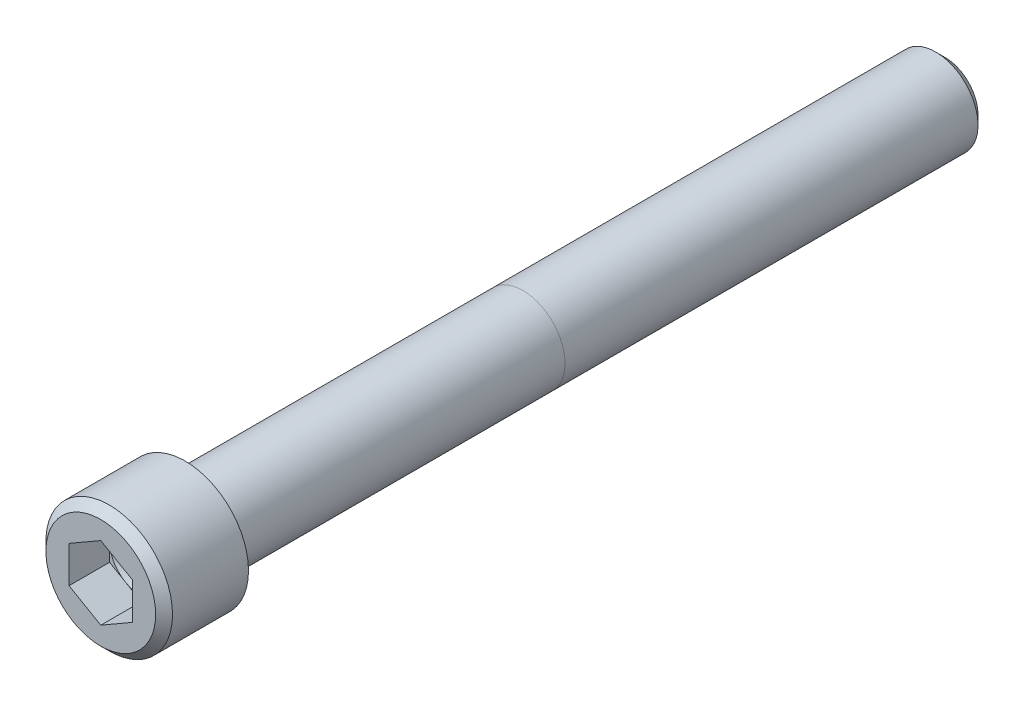
ISO-10303-21;
HEADER;
FILE_DESCRIPTION(('STEP AP214'),'2;1');
FILE_NAME('part.step','',(''),(''),'','','');
FILE_SCHEMA(('AUTOMOTIVE_DESIGN { 1 0 10303 214 1 1 1 1 }'));
ENDSEC;
DATA;
#1=APPLICATION_CONTEXT('core data for automotive mechanical design processes');
#2=APPLICATION_PROTOCOL_DEFINITION('international standard','automotive_design',2000,#1);
#3=PRODUCT_CONTEXT('',#1,'mechanical');
#4=PRODUCT('Part','Part','',(#3));
#5=PRODUCT_RELATED_PRODUCT_CATEGORY('part','',(#4));
#6=PRODUCT_DEFINITION_FORMATION('','',#4);
#7=PRODUCT_DEFINITION_CONTEXT('part definition',#1,'design');
#8=PRODUCT_DEFINITION('design','',#6,#7);
#9=PRODUCT_DEFINITION_SHAPE('','',#8);
#10=(LENGTH_UNIT() NAMED_UNIT(*) SI_UNIT(.MILLI.,.METRE.));
#11=(NAMED_UNIT(*) PLANE_ANGLE_UNIT() SI_UNIT($,.RADIAN.));
#12=(NAMED_UNIT(*) SI_UNIT($,.STERADIAN.) SOLID_ANGLE_UNIT());
#13=UNCERTAINTY_MEASURE_WITH_UNIT(LENGTH_MEASURE(1.E-05),#10,'distance_accuracy_value','');
#14=(GEOMETRIC_REPRESENTATION_CONTEXT(3) GLOBAL_UNCERTAINTY_ASSIGNED_CONTEXT((#13)) GLOBAL_UNIT_ASSIGNED_CONTEXT((#10,
#11,#12)) REPRESENTATION_CONTEXT('',''));
#15=CARTESIAN_POINT('',(0.,0.,0.));
#16=DIRECTION('',(0.,0.,1.));
#17=DIRECTION('',(1.,0.,0.));
#18=AXIS2_PLACEMENT_3D('',#15,#16,#17);
#19=CARTESIAN_POINT('',(0.,0.,-57.15));
#20=DIRECTION('',(0.,0.,1.));
#21=DIRECTION('',(1.,0.,0.));
#22=AXIS2_PLACEMENT_3D('',#19,#20,#21);
#23=CYLINDRICAL_SURFACE('',#22,3.175);
#24=CARTESIAN_POINT('',(0.,0.,-0.1778));
#25=DIRECTION('',(0.,0.,1.));
#26=DIRECTION('',(1.,0.,0.));
#27=AXIS2_PLACEMENT_3D('',#24,#25,#26);
#28=CIRCLE('',#27,3.175);
#29=CARTESIAN_POINT('',(3.175,0.,-0.1778));
#30=VERTEX_POINT('',#29);
#31=EDGE_CURVE('E137',#30,#30,#28,.F.);
#32=ORIENTED_EDGE('',*,*,#31,.T.);
#33=EDGE_LOOP('',(#32));
#34=FACE_BOUND('',#33,.T.);
#35=CARTESIAN_POINT('',(0.,0.,-25.4));
#36=DIRECTION('',(0.,0.,-1.));
#37=DIRECTION('',(-1.,0.,0.));
#38=AXIS2_PLACEMENT_3D('',#35,#36,#37);
#39=CIRCLE('',#38,3.175);
#40=CARTESIAN_POINT('',(-3.175,0.,-25.4));
#41=VERTEX_POINT('',#40);
#42=EDGE_CURVE('E11',#41,#41,#39,.T.);
#43=ORIENTED_EDGE('',*,*,#42,.F.);
#44=EDGE_LOOP('',(#43));
#45=FACE_BOUND('',#44,.T.);
#46=ADVANCED_FACE('F17',(#34,#45),#23,.T.);
#47=CARTESIAN_POINT('',(0.,0.,3.302));
#48=DIRECTION('',(0.,0.,1.));
#49=DIRECTION('',(1.,0.,0.));
#50=AXIS2_PLACEMENT_3D('',#47,#48,#49);
#51=PLANE('',#50);
#52=DIRECTION('',(0.,1.,0.));
#53=VECTOR('',#52,1.);
#54=CARTESIAN_POINT('',(-2.3876,0.,3.302));
#55=LINE('',#54,#53);
#56=CARTESIAN_POINT('',(-2.3876,0.,3.302));
#57=VERTEX_POINT('',#56);
#58=CARTESIAN_POINT('',(-2.3876,1.37848150271715,3.302));
#59=VERTEX_POINT('',#58);
#60=EDGE_CURVE('E194',#57,#59,#55,.T.);
#61=ORIENTED_EDGE('',*,*,#60,.F.);
#62=CARTESIAN_POINT('',(0.,0.,3.302));
#63=DIRECTION('',(0.,0.,-1.));
#64=DIRECTION('',(-1.,0.,0.));
#65=AXIS2_PLACEMENT_3D('',#62,#63,#64);
#66=CIRCLE('',#65,2.3876);
#67=CARTESIAN_POINT('',(-1.1938,2.06772225407573,3.302));
#68=VERTEX_POINT('',#67);
#69=EDGE_CURVE('E32',#57,#68,#66,.T.);
#70=ORIENTED_EDGE('',*,*,#69,.T.);
#71=DIRECTION('',(0.866025403784438,0.5,0.));
#72=VECTOR('',#71,1.);
#73=CARTESIAN_POINT('',(-1.1938,2.06772225407573,3.302));
#74=LINE('',#73,#72);
#75=EDGE_CURVE('E195',#59,#68,#74,.T.);
#76=ORIENTED_EDGE('',*,*,#75,.F.);
#77=EDGE_LOOP('',(#61,#70,#76));
#78=FACE_BOUND('',#77,.T.);
#79=ADVANCED_FACE('F105',(#78),#51,.T.);
#80=CARTESIAN_POINT('',(0.,2.7569630054343,3.302));
#81=VERTEX_POINT('',#80);
#82=EDGE_CURVE('E198',#68,#81,#74,.T.);
#83=ORIENTED_EDGE('',*,*,#82,.F.);
#84=CARTESIAN_POINT('',(1.1938,2.06772225407573,3.302));
#85=VERTEX_POINT('',#84);
#86=EDGE_CURVE('E139',#68,#85,#66,.T.);
#87=ORIENTED_EDGE('',*,*,#86,.T.);
#88=DIRECTION('',(0.866025403784439,-0.5,0.));
#89=VECTOR('',#88,1.);
#90=CARTESIAN_POINT('',(1.1938,2.06772225407573,3.302));
#91=LINE('',#90,#89);
#92=EDGE_CURVE('E199',#81,#85,#91,.T.);
#93=ORIENTED_EDGE('',*,*,#92,.F.);
#94=EDGE_LOOP('',(#83,#87,#93));
#95=FACE_BOUND('',#94,.T.);
#96=ADVANCED_FACE('F111',(#95),#51,.T.);
#97=CARTESIAN_POINT('',(2.3876,1.37848150271715,3.302));
#98=VERTEX_POINT('',#97);
#99=EDGE_CURVE('E166',#85,#98,#91,.T.);
#100=ORIENTED_EDGE('',*,*,#99,.F.);
#101=CARTESIAN_POINT('',(2.3876,0.,3.302));
#102=VERTEX_POINT('',#101);
#103=EDGE_CURVE('E206',#85,#102,#66,.T.);
#104=ORIENTED_EDGE('',*,*,#103,.T.);
#105=DIRECTION('',(0.,-1.,0.));
#106=VECTOR('',#105,1.);
#107=CARTESIAN_POINT('',(2.3876,0.,3.302));
#108=LINE('',#107,#106);
#109=EDGE_CURVE('E162',#98,#102,#108,.T.);
#110=ORIENTED_EDGE('',*,*,#109,.F.);
#111=EDGE_LOOP('',(#100,#104,#110));
#112=FACE_BOUND('',#111,.T.);
#113=ADVANCED_FACE('F223',(#112),#51,.T.);
#114=CARTESIAN_POINT('',(2.3876,-1.37848150271715,3.302));
#115=VERTEX_POINT('',#114);
#116=EDGE_CURVE('E182',#102,#115,#108,.T.);
#117=ORIENTED_EDGE('',*,*,#116,.F.);
#118=CARTESIAN_POINT('',(1.1938,-2.06772225407573,3.302));
#119=VERTEX_POINT('',#118);
#120=EDGE_CURVE('E211',#102,#119,#66,.T.);
#121=ORIENTED_EDGE('',*,*,#120,.T.);
#122=DIRECTION('',(-0.866025403784439,-0.5,0.));
#123=VECTOR('',#122,1.);
#124=CARTESIAN_POINT('',(1.1938,-2.06772225407573,3.302));
#125=LINE('',#124,#123);
#126=EDGE_CURVE('E183',#115,#119,#125,.T.);
#127=ORIENTED_EDGE('',*,*,#126,.F.);
#128=EDGE_LOOP('',(#117,#121,#127));
#129=FACE_BOUND('',#128,.T.);
#130=ADVANCED_FACE('F224',(#129),#51,.T.);
#131=CARTESIAN_POINT('',(0.,-2.7569630054343,3.302));
#132=VERTEX_POINT('',#131);
#133=EDGE_CURVE('E186',#119,#132,#125,.T.);
#134=ORIENTED_EDGE('',*,*,#133,.F.);
#135=CARTESIAN_POINT('',(-1.1938,-2.06772225407573,3.302));
#136=VERTEX_POINT('',#135);
#137=EDGE_CURVE('E207',#119,#136,#66,.T.);
#138=ORIENTED_EDGE('',*,*,#137,.T.);
#139=DIRECTION('',(-0.866025403784439,0.5,0.));
#140=VECTOR('',#139,1.);
#141=CARTESIAN_POINT('',(-1.1938,-2.06772225407573,3.302));
#142=LINE('',#141,#140);
#143=EDGE_CURVE('E187',#132,#136,#142,.T.);
#144=ORIENTED_EDGE('',*,*,#143,.F.);
#145=EDGE_LOOP('',(#134,#138,#144));
#146=FACE_BOUND('',#145,.T.);
#147=ADVANCED_FACE('F124',(#146),#51,.T.);
#148=CARTESIAN_POINT('',(0.,0.,6.35));
#149=DIRECTION('',(0.,0.,1.));
#150=DIRECTION('',(1.,0.,0.));
#151=AXIS2_PLACEMENT_3D('',#148,#149,#150);
#152=PLANE('',#151);
#153=CARTESIAN_POINT('',(0.,0.,6.35));
#154=DIRECTION('',(0.,0.,1.));
#155=DIRECTION('',(1.,0.,0.));
#156=AXIS2_PLACEMENT_3D('',#153,#154,#155);
#157=CIRCLE('',#156,4.1275);
#158=CARTESIAN_POINT('',(4.1275,0.,6.35));
#159=VERTEX_POINT('',#158);
#160=EDGE_CURVE('E144',#159,#159,#157,.T.);
#161=ORIENTED_EDGE('',*,*,#160,.T.);
#162=EDGE_LOOP('',(#161));
#163=FACE_BOUND('',#162,.T.);
#164=DIRECTION('',(0.866025403784438,0.5,0.));
#165=VECTOR('',#164,1.);
#166=CARTESIAN_POINT('',(-1.1938,2.06772225407573,6.35));
#167=LINE('',#166,#165);
#168=CARTESIAN_POINT('',(-2.3876,1.37848150271715,6.35));
#169=VERTEX_POINT('',#168);
#170=CARTESIAN_POINT('',(0.,2.7569630054343,6.35));
#171=VERTEX_POINT('',#170);
#172=EDGE_CURVE('E174',#169,#171,#167,.T.);
#173=ORIENTED_EDGE('',*,*,#172,.T.);
#174=DIRECTION('',(0.866025403784439,-0.5,0.));
#175=VECTOR('',#174,1.);
#176=CARTESIAN_POINT('',(1.1938,2.06772225407573,6.35));
#177=LINE('',#176,#175);
#178=CARTESIAN_POINT('',(2.3876,1.37848150271715,6.35));
#179=VERTEX_POINT('',#178);
#180=EDGE_CURVE('E177',#171,#179,#177,.T.);
#181=ORIENTED_EDGE('',*,*,#180,.T.);
#182=DIRECTION('',(0.,-1.,0.));
#183=VECTOR('',#182,1.);
#184=CARTESIAN_POINT('',(2.3876,0.,6.35));
#185=LINE('',#184,#183);
#186=CARTESIAN_POINT('',(2.3876,-1.37848150271715,6.35));
#187=VERTEX_POINT('',#186);
#188=EDGE_CURVE('E163',#179,#187,#185,.T.);
#189=ORIENTED_EDGE('',*,*,#188,.T.);
#190=DIRECTION('',(-0.866025403784439,-0.5,0.));
#191=VECTOR('',#190,1.);
#192=CARTESIAN_POINT('',(1.1938,-2.06772225407573,6.35));
#193=LINE('',#192,#191);
#194=CARTESIAN_POINT('',(0.,-2.7569630054343,6.35));
#195=VERTEX_POINT('',#194);
#196=EDGE_CURVE('E40',#187,#195,#193,.T.);
#197=ORIENTED_EDGE('',*,*,#196,.T.);
#198=DIRECTION('',(-0.866025403784439,0.5,0.));
#199=VECTOR('',#198,1.);
#200=CARTESIAN_POINT('',(-1.1938,-2.06772225407573,6.35));
#201=LINE('',#200,#199);
#202=CARTESIAN_POINT('',(-2.3876,-1.37848150271715,6.35));
#203=VERTEX_POINT('',#202);
#204=EDGE_CURVE('E168',#195,#203,#201,.T.);
#205=ORIENTED_EDGE('',*,*,#204,.T.);
#206=DIRECTION('',(0.,1.,0.));
#207=VECTOR('',#206,1.);
#208=CARTESIAN_POINT('',(-2.3876,0.,6.35));
#209=LINE('',#208,#207);
#210=EDGE_CURVE('E171',#203,#169,#209,.T.);
#211=ORIENTED_EDGE('',*,*,#210,.T.);
#212=EDGE_LOOP('',(#173,#181,#189,#197,#205,#211));
#213=FACE_BOUND('',#212,.T.);
#214=ADVANCED_FACE('F248',(#163,#213),#152,.T.);
#215=CARTESIAN_POINT('',(0.,0.,6.35));
#216=DIRECTION('',(0.,0.,-1.));
#217=DIRECTION('',(-1.,0.,0.));
#218=AXIS2_PLACEMENT_3D('',#215,#216,#217);
#219=CYLINDRICAL_SURFACE('',#218,4.7625);
#220=CARTESIAN_POINT('',(0.,0.,5.715));
#221=DIRECTION('',(0.,0.,1.));
#222=DIRECTION('',(1.,0.,0.));
#223=AXIS2_PLACEMENT_3D('',#220,#221,#222);
#224=CIRCLE('',#223,4.7625);
#225=CARTESIAN_POINT('',(4.7625,0.,5.715));
#226=VERTEX_POINT('',#225);
#227=EDGE_CURVE('E140',#226,#226,#224,.F.);
#228=ORIENTED_EDGE('',*,*,#227,.T.);
#229=EDGE_LOOP('',(#228));
#230=FACE_BOUND('',#229,.T.);
#231=CARTESIAN_POINT('',(0.,0.,0.));
#232=DIRECTION('',(0.,0.,1.));
#233=DIRECTION('',(1.,0.,0.));
#234=AXIS2_PLACEMENT_3D('',#231,#232,#233);
#235=CIRCLE('',#234,4.7625);
#236=CARTESIAN_POINT('',(4.7625,0.,0.));
#237=VERTEX_POINT('',#236);
#238=EDGE_CURVE('E147',#237,#237,#235,.T.);
#239=ORIENTED_EDGE('',*,*,#238,.T.);
#240=EDGE_LOOP('',(#239));
#241=FACE_BOUND('',#240,.T.);
#242=ADVANCED_FACE('F250',(#230,#241),#219,.T.);
#243=CARTESIAN_POINT('',(0.,0.,0.));
#244=DIRECTION('',(0.,0.,1.));
#245=DIRECTION('',(1.,0.,0.));
#246=AXIS2_PLACEMENT_3D('',#243,#244,#245);
#247=PLANE('',#246);
#248=CARTESIAN_POINT('',(0.,0.,0.));
#249=DIRECTION('',(0.,0.,1.));
#250=DIRECTION('',(1.,0.,0.));
#251=AXIS2_PLACEMENT_3D('',#248,#249,#250);
#252=CIRCLE('',#251,3.3528);
#253=CARTESIAN_POINT('',(3.3528,0.,0.));
#254=VERTEX_POINT('',#253);
#255=EDGE_CURVE('E132',#254,#254,#252,.T.);
#256=ORIENTED_EDGE('',*,*,#255,.T.);
#257=EDGE_LOOP('',(#256));
#258=FACE_BOUND('',#257,.T.);
#259=ORIENTED_EDGE('',*,*,#238,.F.);
#260=EDGE_LOOP('',(#259));
#261=FACE_BOUND('',#260,.T.);
#262=ADVANCED_FACE('F257',(#258,#261),#247,.F.);
#263=CARTESIAN_POINT('',(0.,0.,6.35));
#264=DIRECTION('',(0.,0.,-1.));
#265=DIRECTION('',(-1.,0.,0.));
#266=AXIS2_PLACEMENT_3D('',#263,#264,#265);
#267=CONICAL_SURFACE('',#266,4.1275,0.785398163397448);
#268=ORIENTED_EDGE('',*,*,#227,.F.);
#269=EDGE_LOOP('',(#268));
#270=FACE_BOUND('',#269,.T.);
#271=ORIENTED_EDGE('',*,*,#160,.F.);
#272=EDGE_LOOP('',(#271));
#273=FACE_BOUND('',#272,.T.);
#274=ADVANCED_FACE('F264',(#270,#273),#267,.T.);
#275=CARTESIAN_POINT('',(1.1938,2.06772225407573,3.302));
#276=DIRECTION('',(-0.5,-0.866025403784439,0.));
#277=DIRECTION('',(0.866025403784439,-0.5,0.));
#278=AXIS2_PLACEMENT_3D('',#275,#276,#277);
#279=PLANE('',#278);
#280=ORIENTED_EDGE('',*,*,#180,.F.);
#281=DIRECTION('',(0.,0.,1.));
#282=VECTOR('',#281,1.);
#283=CARTESIAN_POINT('',(0.,2.7569630054343,3.302));
#284=LINE('',#283,#282);
#285=EDGE_CURVE('E150',#81,#171,#284,.T.);
#286=ORIENTED_EDGE('',*,*,#285,.F.);
#287=ORIENTED_EDGE('',*,*,#92,.T.);
#288=ORIENTED_EDGE('',*,*,#99,.T.);
#289=DIRECTION('',(0.,0.,1.));
#290=VECTOR('',#289,1.);
#291=CARTESIAN_POINT('',(2.3876,1.37848150271715,3.302));
#292=LINE('',#291,#290);
#293=EDGE_CURVE('E160',#98,#179,#292,.T.);
#294=ORIENTED_EDGE('',*,*,#293,.T.);
#295=EDGE_LOOP('',(#280,#286,#287,#288,#294));
#296=FACE_BOUND('',#295,.T.);
#297=ADVANCED_FACE('F230',(#296),#279,.T.);
#298=CARTESIAN_POINT('',(-1.1938,2.06772225407573,3.302));
#299=DIRECTION('',(0.5,-0.866025403784438,0.));
#300=DIRECTION('',(0.866025403784438,0.5,0.));
#301=AXIS2_PLACEMENT_3D('',#298,#299,#300);
#302=PLANE('',#301);
#303=ORIENTED_EDGE('',*,*,#172,.F.);
#304=DIRECTION('',(0.,0.,1.));
#305=VECTOR('',#304,1.);
#306=CARTESIAN_POINT('',(-2.3876,1.37848150271715,3.302));
#307=LINE('',#306,#305);
#308=EDGE_CURVE('E152',#59,#169,#307,.T.);
#309=ORIENTED_EDGE('',*,*,#308,.F.);
#310=ORIENTED_EDGE('',*,*,#75,.T.);
#311=ORIENTED_EDGE('',*,*,#82,.T.);
#312=ORIENTED_EDGE('',*,*,#285,.T.);
#313=EDGE_LOOP('',(#303,#309,#310,#311,#312));
#314=FACE_BOUND('',#313,.T.);
#315=ADVANCED_FACE('F237',(#314),#302,.T.);
#316=CARTESIAN_POINT('',(-2.3876,0.,3.302));
#317=DIRECTION('',(1.,0.,0.));
#318=DIRECTION('',(0.,1.,0.));
#319=AXIS2_PLACEMENT_3D('',#316,#317,#318);
#320=PLANE('',#319);
#321=ORIENTED_EDGE('',*,*,#210,.F.);
#322=DIRECTION('',(0.,0.,1.));
#323=VECTOR('',#322,1.);
#324=CARTESIAN_POINT('',(-2.3876,-1.37848150271715,3.302));
#325=LINE('',#324,#323);
#326=CARTESIAN_POINT('',(-2.3876,-1.37848150271715,3.302));
#327=VERTEX_POINT('',#326);
#328=EDGE_CURVE('E154',#327,#203,#325,.T.);
#329=ORIENTED_EDGE('',*,*,#328,.F.);
#330=EDGE_CURVE('E191',#327,#57,#55,.T.);
#331=ORIENTED_EDGE('',*,*,#330,.T.);
#332=ORIENTED_EDGE('',*,*,#60,.T.);
#333=ORIENTED_EDGE('',*,*,#308,.T.);
#334=EDGE_LOOP('',(#321,#329,#331,#332,#333));
#335=FACE_BOUND('',#334,.T.);
#336=ADVANCED_FACE('F241',(#335),#320,.T.);
#337=CARTESIAN_POINT('',(-1.1938,-2.06772225407573,3.302));
#338=DIRECTION('',(0.5,0.866025403784439,0.));
#339=DIRECTION('',(-0.866025403784439,0.5,0.));
#340=AXIS2_PLACEMENT_3D('',#337,#338,#339);
#341=PLANE('',#340);
#342=ORIENTED_EDGE('',*,*,#204,.F.);
#343=DIRECTION('',(0.,0.,1.));
#344=VECTOR('',#343,1.);
#345=CARTESIAN_POINT('',(0.,-2.7569630054343,3.302));
#346=LINE('',#345,#344);
#347=EDGE_CURVE('E156',#132,#195,#346,.T.);
#348=ORIENTED_EDGE('',*,*,#347,.F.);
#349=ORIENTED_EDGE('',*,*,#143,.T.);
#350=EDGE_CURVE('E190',#136,#327,#142,.T.);
#351=ORIENTED_EDGE('',*,*,#350,.T.);
#352=ORIENTED_EDGE('',*,*,#328,.T.);
#353=EDGE_LOOP('',(#342,#348,#349,#351,#352));
#354=FACE_BOUND('',#353,.T.);
#355=ADVANCED_FACE('F245',(#354),#341,.T.);
#356=CARTESIAN_POINT('',(1.1938,-2.06772225407573,3.302));
#357=DIRECTION('',(-0.5,0.866025403784439,0.));
#358=DIRECTION('',(-0.866025403784439,-0.5,0.));
#359=AXIS2_PLACEMENT_3D('',#356,#357,#358);
#360=PLANE('',#359);
#361=ORIENTED_EDGE('',*,*,#196,.F.);
#362=DIRECTION('',(0.,0.,1.));
#363=VECTOR('',#362,1.);
#364=CARTESIAN_POINT('',(2.3876,-1.37848150271715,3.302));
#365=LINE('',#364,#363);
#366=EDGE_CURVE('E158',#115,#187,#365,.T.);
#367=ORIENTED_EDGE('',*,*,#366,.F.);
#368=ORIENTED_EDGE('',*,*,#126,.T.);
#369=ORIENTED_EDGE('',*,*,#133,.T.);
#370=ORIENTED_EDGE('',*,*,#347,.T.);
#371=EDGE_LOOP('',(#361,#367,#368,#369,#370));
#372=FACE_BOUND('',#371,.T.);
#373=ADVANCED_FACE('F246',(#372),#360,.T.);
#374=CARTESIAN_POINT('',(2.3876,0.,3.302));
#375=DIRECTION('',(-1.,0.,0.));
#376=DIRECTION('',(0.,0.,1.));
#377=AXIS2_PLACEMENT_3D('',#374,#375,#376);
#378=PLANE('',#377);
#379=ORIENTED_EDGE('',*,*,#188,.F.);
#380=ORIENTED_EDGE('',*,*,#293,.F.);
#381=ORIENTED_EDGE('',*,*,#109,.T.);
#382=ORIENTED_EDGE('',*,*,#116,.T.);
#383=ORIENTED_EDGE('',*,*,#366,.T.);
#384=EDGE_LOOP('',(#379,#380,#381,#382,#383));
#385=FACE_BOUND('',#384,.T.);
#386=ADVANCED_FACE('F122',(#385),#378,.T.);
#387=ORIENTED_EDGE('',*,*,#350,.F.);
#388=EDGE_CURVE('E143',#136,#57,#66,.T.);
#389=ORIENTED_EDGE('',*,*,#388,.T.);
#390=ORIENTED_EDGE('',*,*,#330,.F.);
#391=EDGE_LOOP('',(#387,#389,#390));
#392=FACE_BOUND('',#391,.T.);
#393=ADVANCED_FACE('F114',(#392),#51,.T.);
#394=ORIENTED_EDGE('',*,*,#42,.T.);
#395=EDGE_LOOP('',(#394));
#396=FACE_BOUND('',#395,.T.);
#397=CARTESIAN_POINT('',(0.,0.,-56.46259233875));
#398=DIRECTION('',(0.,0.,-1.));
#399=DIRECTION('',(-1.,0.,0.));
#400=AXIS2_PLACEMENT_3D('',#397,#398,#399);
#401=CIRCLE('',#400,3.175);
#402=CARTESIAN_POINT('',(-3.175,0.,-56.46259233875));
#403=VERTEX_POINT('',#402);
#404=EDGE_CURVE('E25',#403,#403,#401,.F.);
#405=ORIENTED_EDGE('',*,*,#404,.T.);
#406=EDGE_LOOP('',(#405));
#407=FACE_BOUND('',#406,.T.);
#408=ADVANCED_FACE('F101',(#396,#407),#23,.T.);
#409=CARTESIAN_POINT('',(0.,0.,-57.15));
#410=DIRECTION('',(0.,0.,-1.));
#411=DIRECTION('',(1.,0.,0.));
#412=AXIS2_PLACEMENT_3D('',#409,#410,#411);
#413=PLANE('',#412);
#414=CARTESIAN_POINT('',(0.,0.,-57.15));
#415=DIRECTION('',(0.,0.,-1.));
#416=DIRECTION('',(-1.,0.,0.));
#417=AXIS2_PLACEMENT_3D('',#414,#415,#416);
#418=CIRCLE('',#417,2.48759233875);
#419=CARTESIAN_POINT('',(-2.48759233875,0.,-57.15));
#420=VERTEX_POINT('',#419);
#421=EDGE_CURVE('E130',#420,#420,#418,.T.);
#422=ORIENTED_EDGE('',*,*,#421,.T.);
#423=EDGE_LOOP('',(#422));
#424=FACE_BOUND('',#423,.T.);
#425=ADVANCED_FACE('F93',(#424),#413,.T.);
#426=CARTESIAN_POINT('',(0.,0.,1.92351849728284));
#427=DIRECTION('',(0.,0.,1.));
#428=DIRECTION('',(1.,0.,0.));
#429=AXIS2_PLACEMENT_3D('',#426,#427,#428);
#430=CONICAL_SURFACE('',#429,0.,1.0471975511966);
#431=ORIENTED_EDGE('',*,*,#69,.F.);
#432=ORIENTED_EDGE('',*,*,#388,.F.);
#433=ORIENTED_EDGE('',*,*,#137,.F.);
#434=ORIENTED_EDGE('',*,*,#120,.F.);
#435=ORIENTED_EDGE('',*,*,#103,.F.);
#436=ORIENTED_EDGE('',*,*,#86,.F.);
#437=EDGE_LOOP('',(#431,#432,#433,#434,#435,#436));
#438=FACE_BOUND('',#437,.T.);
#439=CARTESIAN_POINT('',(0.,0.,1.92351849728284));
#440=VERTEX_POINT('',#439);
#441=VERTEX_LOOP('',#440);
#442=FACE_BOUND('',#441,.T.);
#443=ADVANCED_FACE('F90',(#438,#442),#430,.F.);
#444=CARTESIAN_POINT('',(0.,0.,-0.1778));
#445=DIRECTION('',(0.,0.,1.));
#446=DIRECTION('',(1.,0.,0.));
#447=AXIS2_PLACEMENT_3D('',#444,#445,#446);
#448=TOROIDAL_SURFACE('',#447,3.3528,0.1778);
#449=ORIENTED_EDGE('',*,*,#255,.F.);
#450=EDGE_LOOP('',(#449));
#451=FACE_BOUND('',#450,.T.);
#452=ORIENTED_EDGE('',*,*,#31,.F.);
#453=EDGE_LOOP('',(#452));
#454=FACE_BOUND('',#453,.T.);
#455=ADVANCED_FACE('F92',(#451,#454),#448,.F.);
#456=CARTESIAN_POINT('',(0.,0.,-57.15));
#457=DIRECTION('',(0.,0.,1.));
#458=DIRECTION('',(1.,0.,0.));
#459=AXIS2_PLACEMENT_3D('',#456,#457,#458);
#460=CONICAL_SURFACE('',#459,2.48759233875,0.785398163397448);
#461=ORIENTED_EDGE('',*,*,#404,.F.);
#462=EDGE_LOOP('',(#461));
#463=FACE_BOUND('',#462,.T.);
#464=ORIENTED_EDGE('',*,*,#421,.F.);
#465=EDGE_LOOP('',(#464));
#466=FACE_BOUND('',#465,.T.);
#467=ADVANCED_FACE('F19',(#463,#466),#460,.T.);
#468=CLOSED_SHELL('',(#46,#79,#96,#113,#130,#147,#214,#242,#262,#274,#297,#315,#336,#355,#373,
#386,#393,#408,#425,#443,#455,#467));
#469=MANIFOLD_SOLID_BREP('B1',#468);
#470=ADVANCED_BREP_SHAPE_REPRESENTATION('',(#18,#469),#14);
#471=SHAPE_DEFINITION_REPRESENTATION(#9,#470);
ENDSEC;
END-ISO-10303-21;
